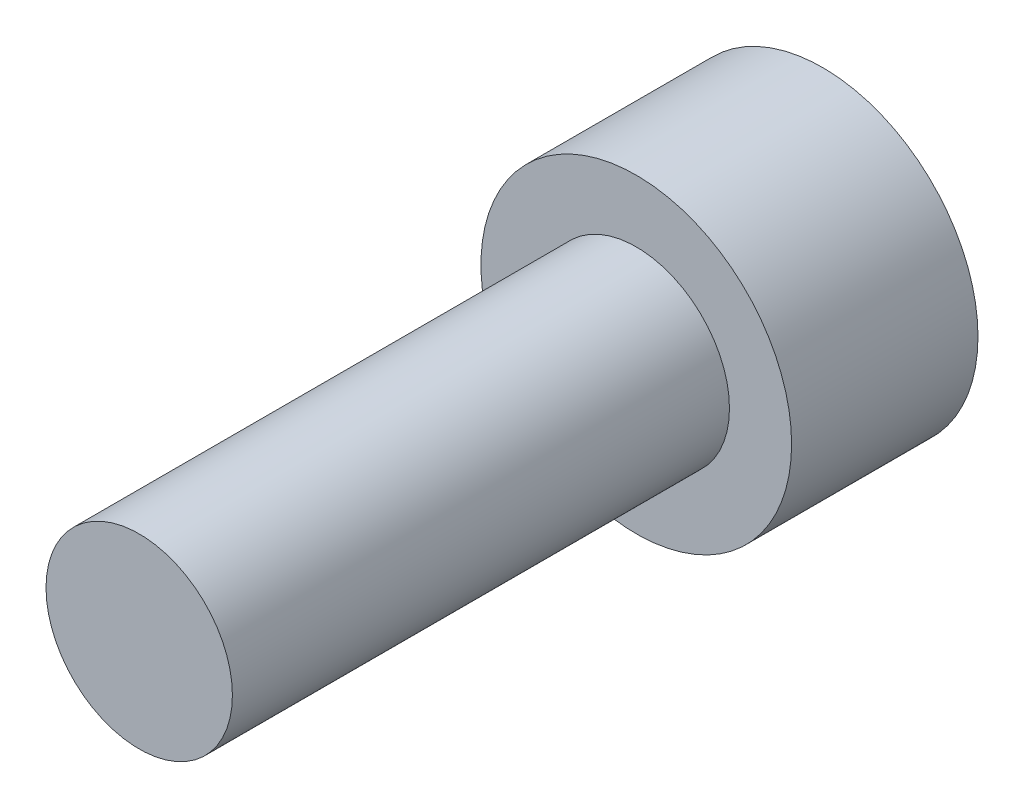
ISO-10303-21;
HEADER;
FILE_DESCRIPTION(('STEP AP214'),'2;1');
FILE_NAME('part.step','',(''),(''),'','','');
FILE_SCHEMA(('AUTOMOTIVE_DESIGN { 1 0 10303 214 1 1 1 1 }'));
ENDSEC;
DATA;
#1=APPLICATION_CONTEXT('core data for automotive mechanical design processes');
#2=APPLICATION_PROTOCOL_DEFINITION('international standard','automotive_design',2000,#1);
#3=PRODUCT_CONTEXT('',#1,'mechanical');
#4=PRODUCT('Part','Part','',(#3));
#5=PRODUCT_RELATED_PRODUCT_CATEGORY('part','',(#4));
#6=PRODUCT_DEFINITION_FORMATION('','',#4);
#7=PRODUCT_DEFINITION_CONTEXT('part definition',#1,'design');
#8=PRODUCT_DEFINITION('design','',#6,#7);
#9=PRODUCT_DEFINITION_SHAPE('','',#8);
#10=(LENGTH_UNIT() NAMED_UNIT(*) SI_UNIT(.MILLI.,.METRE.));
#11=(NAMED_UNIT(*) PLANE_ANGLE_UNIT() SI_UNIT($,.RADIAN.));
#12=(NAMED_UNIT(*) SI_UNIT($,.STERADIAN.) SOLID_ANGLE_UNIT());
#13=UNCERTAINTY_MEASURE_WITH_UNIT(LENGTH_MEASURE(1.E-05),#10,'distance_accuracy_value','');
#14=(GEOMETRIC_REPRESENTATION_CONTEXT(3) GLOBAL_UNCERTAINTY_ASSIGNED_CONTEXT((#13)) GLOBAL_UNIT_ASSIGNED_CONTEXT((#10,
#11,#12)) REPRESENTATION_CONTEXT('',''));
#15=CARTESIAN_POINT('',(0.,0.,0.));
#16=DIRECTION('',(0.,0.,1.));
#17=DIRECTION('',(1.,0.,0.));
#18=AXIS2_PLACEMENT_3D('',#15,#16,#17);
#19=CARTESIAN_POINT('',(0.,0.,16.));
#20=DIRECTION('',(0.,0.,-1.));
#21=DIRECTION('',(-1.,0.,0.));
#22=AXIS2_PLACEMENT_3D('',#19,#20,#21);
#23=CYLINDRICAL_SURFACE('',#22,3.);
#24=CARTESIAN_POINT('',(0.,0.,16.));
#25=DIRECTION('',(0.,0.,1.));
#26=DIRECTION('',(1.,0.,0.));
#27=AXIS2_PLACEMENT_3D('',#24,#25,#26);
#28=CIRCLE('',#27,3.);
#29=CARTESIAN_POINT('',(3.,0.,16.));
#30=VERTEX_POINT('',#29);
#31=EDGE_CURVE('E10',#30,#30,#28,.T.);
#32=ORIENTED_EDGE('',*,*,#31,.F.);
#33=EDGE_LOOP('',(#32));
#34=FACE_BOUND('',#33,.T.);
#35=CARTESIAN_POINT('',(0.,0.,0.));
#36=DIRECTION('',(0.,0.,1.));
#37=DIRECTION('',(1.,0.,0.));
#38=AXIS2_PLACEMENT_3D('',#35,#36,#37);
#39=CIRCLE('',#38,3.);
#40=CARTESIAN_POINT('',(3.,0.,0.));
#41=VERTEX_POINT('',#40);
#42=EDGE_CURVE('E44',#41,#41,#39,.T.);
#43=ORIENTED_EDGE('',*,*,#42,.T.);
#44=EDGE_LOOP('',(#43));
#45=FACE_BOUND('',#44,.T.);
#46=ADVANCED_FACE('F41',(#34,#45),#23,.T.);
#47=CARTESIAN_POINT('',(0.,0.,16.));
#48=DIRECTION('',(0.,0.,1.));
#49=DIRECTION('',(1.,0.,0.));
#50=AXIS2_PLACEMENT_3D('',#47,#48,#49);
#51=PLANE('',#50);
#52=ORIENTED_EDGE('',*,*,#31,.T.);
#53=EDGE_LOOP('',(#52));
#54=FACE_BOUND('',#53,.T.);
#55=ADVANCED_FACE('F76',(#54),#51,.T.);
#56=CARTESIAN_POINT('',(0.,0.,-6.));
#57=DIRECTION('',(0.,0.,1.));
#58=DIRECTION('',(1.,0.,0.));
#59=AXIS2_PLACEMENT_3D('',#56,#57,#58);
#60=CYLINDRICAL_SURFACE('',#59,5.);
#61=CARTESIAN_POINT('',(0.,0.,-6.));
#62=DIRECTION('',(0.,0.,1.));
#63=DIRECTION('',(1.,0.,0.));
#64=AXIS2_PLACEMENT_3D('',#61,#62,#63);
#65=CIRCLE('',#64,5.);
#66=CARTESIAN_POINT('',(5.,0.,-6.));
#67=VERTEX_POINT('',#66);
#68=EDGE_CURVE('E53',#67,#67,#65,.T.);
#69=ORIENTED_EDGE('',*,*,#68,.T.);
#70=EDGE_LOOP('',(#69));
#71=FACE_BOUND('',#70,.T.);
#72=CARTESIAN_POINT('',(0.,0.,0.));
#73=DIRECTION('',(0.,0.,1.));
#74=DIRECTION('',(1.,0.,0.));
#75=AXIS2_PLACEMENT_3D('',#72,#73,#74);
#76=CIRCLE('',#75,5.);
#77=CARTESIAN_POINT('',(5.,0.,0.));
#78=VERTEX_POINT('',#77);
#79=EDGE_CURVE('E55',#78,#78,#76,.T.);
#80=ORIENTED_EDGE('',*,*,#79,.F.);
#81=EDGE_LOOP('',(#80));
#82=FACE_BOUND('',#81,.T.);
#83=ADVANCED_FACE('F63',(#71,#82),#60,.T.);
#84=CARTESIAN_POINT('',(0.,0.,-6.));
#85=DIRECTION('',(0.,0.,1.));
#86=DIRECTION('',(1.,0.,0.));
#87=AXIS2_PLACEMENT_3D('',#84,#85,#86);
#88=PLANE('',#87);
#89=ORIENTED_EDGE('',*,*,#68,.F.);
#90=EDGE_LOOP('',(#89));
#91=FACE_BOUND('',#90,.T.);
#92=ADVANCED_FACE('F66',(#91),#88,.F.);
#93=CARTESIAN_POINT('',(0.,0.,0.));
#94=DIRECTION('',(0.,0.,1.));
#95=DIRECTION('',(1.,0.,0.));
#96=AXIS2_PLACEMENT_3D('',#93,#94,#95);
#97=PLANE('',#96);
#98=ORIENTED_EDGE('',*,*,#42,.F.);
#99=EDGE_LOOP('',(#98));
#100=FACE_BOUND('',#99,.T.);
#101=ORIENTED_EDGE('',*,*,#79,.T.);
#102=EDGE_LOOP('',(#101));
#103=FACE_BOUND('',#102,.T.);
#104=ADVANCED_FACE('F68',(#100,#103),#97,.T.);
#105=CLOSED_SHELL('',(#46,#55,#83,#92,#104));
#106=MANIFOLD_SOLID_BREP('B2',#105);
#107=ADVANCED_BREP_SHAPE_REPRESENTATION('',(#18,#106),#14);
#108=SHAPE_DEFINITION_REPRESENTATION(#9,#107);
ENDSEC;
END-ISO-10303-21;
